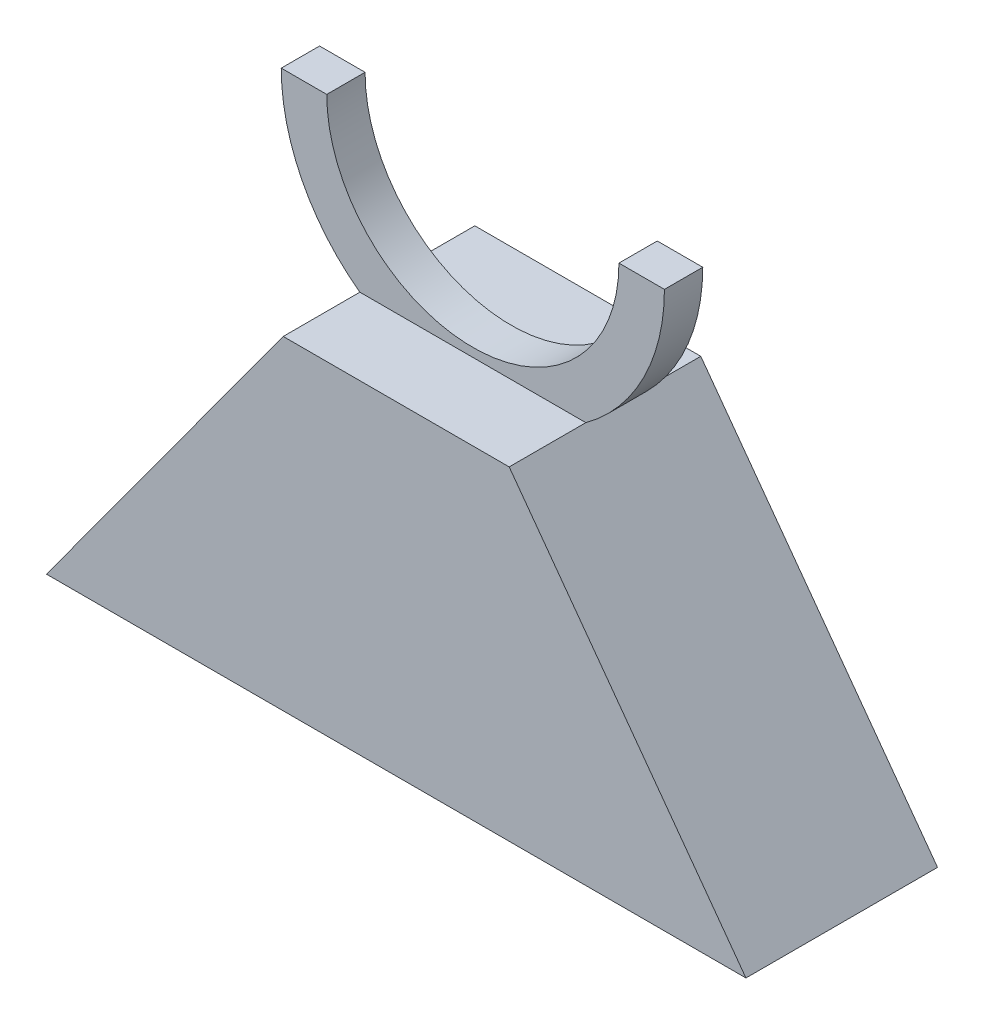
ISO-10303-21;
HEADER;
FILE_DESCRIPTION(('STEP AP214'),'2;1');
FILE_NAME('part.step','',(''),(''),'','','');
FILE_SCHEMA(('AUTOMOTIVE_DESIGN { 1 0 10303 214 1 1 1 1 }'));
ENDSEC;
DATA;
#1=APPLICATION_CONTEXT('core data for automotive mechanical design processes');
#2=APPLICATION_PROTOCOL_DEFINITION('international standard','automotive_design',2000,#1);
#3=PRODUCT_CONTEXT('',#1,'mechanical');
#4=PRODUCT('Part','Part','',(#3));
#5=PRODUCT_RELATED_PRODUCT_CATEGORY('part','',(#4));
#6=PRODUCT_DEFINITION_FORMATION('','',#4);
#7=PRODUCT_DEFINITION_CONTEXT('part definition',#1,'design');
#8=PRODUCT_DEFINITION('design','',#6,#7);
#9=PRODUCT_DEFINITION_SHAPE('','',#8);
#10=(LENGTH_UNIT() NAMED_UNIT(*) SI_UNIT(.MILLI.,.METRE.));
#11=(NAMED_UNIT(*) PLANE_ANGLE_UNIT() SI_UNIT($,.RADIAN.));
#12=(NAMED_UNIT(*) SI_UNIT($,.STERADIAN.) SOLID_ANGLE_UNIT());
#13=UNCERTAINTY_MEASURE_WITH_UNIT(LENGTH_MEASURE(1.E-05),#10,'distance_accuracy_value','');
#14=(GEOMETRIC_REPRESENTATION_CONTEXT(3) GLOBAL_UNCERTAINTY_ASSIGNED_CONTEXT((#13)) GLOBAL_UNIT_ASSIGNED_CONTEXT((#10,
#11,#12)) REPRESENTATION_CONTEXT('',''));
#15=CARTESIAN_POINT('',(0.,0.,0.));
#16=DIRECTION('',(0.,0.,1.));
#17=DIRECTION('',(1.,0.,0.));
#18=AXIS2_PLACEMENT_3D('',#15,#16,#17);
#19=CARTESIAN_POINT('',(0.,0.,-2.));
#20=DIRECTION('',(0.,0.,1.));
#21=DIRECTION('',(1.,0.,0.));
#22=AXIS2_PLACEMENT_3D('',#19,#20,#21);
#23=CYLINDRICAL_SURFACE('',#22,20.);
#24=DIRECTION('',(0.,0.,1.));
#25=VECTOR('',#24,1.);
#26=CARTESIAN_POINT('',(-11.7940862601646,-16.1523846316201,-10.));
#27=LINE('',#26,#25);
#28=CARTESIAN_POINT('',(-11.7940862601646,-16.1523846316201,-2.));
#29=VERTEX_POINT('',#28);
#30=CARTESIAN_POINT('',(-11.7940862601646,-16.1523846316201,2.));
#31=VERTEX_POINT('',#30);
#32=EDGE_CURVE('E155',#29,#31,#27,.T.);
#33=ORIENTED_EDGE('',*,*,#32,.T.);
#34=CARTESIAN_POINT('',(0.,0.,2.));
#35=DIRECTION('',(0.,0.,1.));
#36=DIRECTION('',(-1.,0.,0.));
#37=AXIS2_PLACEMENT_3D('',#34,#35,#36);
#38=CIRCLE('',#37,20.);
#39=CARTESIAN_POINT('',(-20.,0.,2.));
#40=VERTEX_POINT('',#39);
#41=EDGE_CURVE('E165',#40,#31,#38,.T.);
#42=ORIENTED_EDGE('',*,*,#41,.F.);
#43=DIRECTION('',(0.,0.,1.));
#44=VECTOR('',#43,1.);
#45=CARTESIAN_POINT('',(-20.,0.,-2.));
#46=LINE('',#45,#44);
#47=CARTESIAN_POINT('',(-20.,0.,-2.));
#48=VERTEX_POINT('',#47);
#49=EDGE_CURVE('E188',#48,#40,#46,.T.);
#50=ORIENTED_EDGE('',*,*,#49,.F.);
#51=CARTESIAN_POINT('',(0.,0.,-2.));
#52=DIRECTION('',(0.,0.,1.));
#53=DIRECTION('',(-1.,0.,0.));
#54=AXIS2_PLACEMENT_3D('',#51,#52,#53);
#55=CIRCLE('',#54,20.);
#56=EDGE_CURVE('E177',#48,#29,#55,.T.);
#57=ORIENTED_EDGE('',*,*,#56,.T.);
#58=EDGE_LOOP('',(#33,#42,#50,#57));
#59=FACE_BOUND('',#58,.T.);
#60=ADVANCED_FACE('F35',(#59),#23,.T.);
#61=CARTESIAN_POINT('',(0.,0.,-2.));
#62=DIRECTION('',(0.,0.,1.));
#63=DIRECTION('',(1.,0.,0.));
#64=AXIS2_PLACEMENT_3D('',#61,#62,#63);
#65=CYLINDRICAL_SURFACE('',#64,15.25);
#66=DIRECTION('',(0.,0.,1.));
#67=VECTOR('',#66,1.);
#68=CARTESIAN_POINT('',(-15.25,0.,-2.));
#69=LINE('',#68,#67);
#70=CARTESIAN_POINT('',(-15.25,0.,-2.));
#71=VERTEX_POINT('',#70);
#72=CARTESIAN_POINT('',(-15.25,0.,2.));
#73=VERTEX_POINT('',#72);
#74=EDGE_CURVE('E183',#71,#73,#69,.T.);
#75=ORIENTED_EDGE('',*,*,#74,.T.);
#76=CARTESIAN_POINT('',(0.,0.,2.));
#77=DIRECTION('',(0.,0.,-1.));
#78=DIRECTION('',(-1.,0.,0.));
#79=AXIS2_PLACEMENT_3D('',#76,#77,#78);
#80=CIRCLE('',#79,15.25);
#81=CARTESIAN_POINT('',(15.25,0.,2.));
#82=VERTEX_POINT('',#81);
#83=EDGE_CURVE('E158',#82,#73,#80,.T.);
#84=ORIENTED_EDGE('',*,*,#83,.F.);
#85=DIRECTION('',(0.,0.,1.));
#86=VECTOR('',#85,1.);
#87=CARTESIAN_POINT('',(15.25,0.,-2.));
#88=LINE('',#87,#86);
#89=CARTESIAN_POINT('',(15.25,0.,-2.));
#90=VERTEX_POINT('',#89);
#91=EDGE_CURVE('E43',#90,#82,#88,.T.);
#92=ORIENTED_EDGE('',*,*,#91,.F.);
#93=CARTESIAN_POINT('',(0.,0.,-2.));
#94=DIRECTION('',(0.,0.,-1.));
#95=DIRECTION('',(-1.,0.,0.));
#96=AXIS2_PLACEMENT_3D('',#93,#94,#95);
#97=CIRCLE('',#96,15.25);
#98=EDGE_CURVE('E171',#90,#71,#97,.T.);
#99=ORIENTED_EDGE('',*,*,#98,.T.);
#100=EDGE_LOOP('',(#75,#84,#92,#99));
#101=FACE_BOUND('',#100,.T.);
#102=ADVANCED_FACE('F37',(#101),#65,.F.);
#103=CARTESIAN_POINT('',(15.25,0.,-2.));
#104=DIRECTION('',(0.,1.,0.));
#105=DIRECTION('',(0.,0.,1.));
#106=AXIS2_PLACEMENT_3D('',#103,#104,#105);
#107=PLANE('',#106);
#108=ORIENTED_EDGE('',*,*,#91,.T.);
#109=DIRECTION('',(-1.,0.,0.));
#110=VECTOR('',#109,1.);
#111=CARTESIAN_POINT('',(15.25,0.,2.));
#112=LINE('',#111,#110);
#113=CARTESIAN_POINT('',(20.,0.,2.));
#114=VERTEX_POINT('',#113);
#115=EDGE_CURVE('E168',#114,#82,#112,.T.);
#116=ORIENTED_EDGE('',*,*,#115,.F.);
#117=DIRECTION('',(0.,0.,1.));
#118=VECTOR('',#117,1.);
#119=CARTESIAN_POINT('',(20.,0.,-2.));
#120=LINE('',#119,#118);
#121=CARTESIAN_POINT('',(20.,0.,-2.));
#122=VERTEX_POINT('',#121);
#123=EDGE_CURVE('E185',#122,#114,#120,.T.);
#124=ORIENTED_EDGE('',*,*,#123,.F.);
#125=DIRECTION('',(-1.,0.,0.));
#126=VECTOR('',#125,1.);
#127=CARTESIAN_POINT('',(15.25,0.,-2.));
#128=LINE('',#127,#126);
#129=EDGE_CURVE('E180',#122,#90,#128,.T.);
#130=ORIENTED_EDGE('',*,*,#129,.T.);
#131=EDGE_LOOP('',(#108,#116,#124,#130));
#132=FACE_BOUND('',#131,.T.);
#133=ADVANCED_FACE('F200',(#132),#107,.T.);
#134=DIRECTION('',(0.,0.,1.));
#135=VECTOR('',#134,1.);
#136=CARTESIAN_POINT('',(11.7940862601646,-16.1523846316201,-10.));
#137=LINE('',#136,#135);
#138=CARTESIAN_POINT('',(11.7940862601646,-16.1523846316201,-2.));
#139=VERTEX_POINT('',#138);
#140=CARTESIAN_POINT('',(11.7940862601646,-16.1523846316201,2.));
#141=VERTEX_POINT('',#140);
#142=EDGE_CURVE('E50',#139,#141,#137,.T.);
#143=ORIENTED_EDGE('',*,*,#142,.F.);
#144=EDGE_CURVE('E176',#139,#122,#55,.T.);
#145=ORIENTED_EDGE('',*,*,#144,.T.);
#146=ORIENTED_EDGE('',*,*,#123,.T.);
#147=EDGE_CURVE('E164',#141,#114,#38,.T.);
#148=ORIENTED_EDGE('',*,*,#147,.F.);
#149=EDGE_LOOP('',(#143,#145,#146,#148));
#150=FACE_BOUND('',#149,.T.);
#151=ADVANCED_FACE('F210',(#150),#23,.T.);
#152=CARTESIAN_POINT('',(-20.,0.,-2.));
#153=DIRECTION('',(0.,1.,0.));
#154=DIRECTION('',(0.,0.,1.));
#155=AXIS2_PLACEMENT_3D('',#152,#153,#154);
#156=PLANE('',#155);
#157=ORIENTED_EDGE('',*,*,#49,.T.);
#158=DIRECTION('',(-1.,0.,0.));
#159=VECTOR('',#158,1.);
#160=CARTESIAN_POINT('',(-20.,0.,2.));
#161=LINE('',#160,#159);
#162=EDGE_CURVE('E161',#73,#40,#161,.T.);
#163=ORIENTED_EDGE('',*,*,#162,.F.);
#164=ORIENTED_EDGE('',*,*,#74,.F.);
#165=DIRECTION('',(-1.,0.,0.));
#166=VECTOR('',#165,1.);
#167=CARTESIAN_POINT('',(-20.,0.,-2.));
#168=LINE('',#167,#166);
#169=EDGE_CURVE('E173',#71,#48,#168,.T.);
#170=ORIENTED_EDGE('',*,*,#169,.T.);
#171=EDGE_LOOP('',(#157,#163,#164,#170));
#172=FACE_BOUND('',#171,.T.);
#173=ADVANCED_FACE('F192',(#172),#156,.T.);
#174=CARTESIAN_POINT('',(0.,0.,-2.));
#175=DIRECTION('',(0.,0.,-1.));
#176=DIRECTION('',(-1.,0.,0.));
#177=AXIS2_PLACEMENT_3D('',#174,#175,#176);
#178=PLANE('',#177);
#179=DIRECTION('',(1.,0.,0.));
#180=VECTOR('',#179,1.);
#181=CARTESIAN_POINT('',(0.,-16.1523846316201,-2.));
#182=LINE('',#181,#180);
#183=EDGE_CURVE('E150',#29,#139,#182,.T.);
#184=ORIENTED_EDGE('',*,*,#183,.F.);
#185=ORIENTED_EDGE('',*,*,#56,.F.);
#186=ORIENTED_EDGE('',*,*,#169,.F.);
#187=ORIENTED_EDGE('',*,*,#98,.F.);
#188=ORIENTED_EDGE('',*,*,#129,.F.);
#189=ORIENTED_EDGE('',*,*,#144,.F.);
#190=EDGE_LOOP('',(#184,#185,#186,#187,#188,#189));
#191=FACE_BOUND('',#190,.T.);
#192=ADVANCED_FACE('F205',(#191),#178,.T.);
#193=CARTESIAN_POINT('',(0.,0.,2.));
#194=DIRECTION('',(0.,0.,-1.));
#195=DIRECTION('',(-1.,0.,0.));
#196=AXIS2_PLACEMENT_3D('',#193,#194,#195);
#197=PLANE('',#196);
#198=ORIENTED_EDGE('',*,*,#41,.T.);
#199=DIRECTION('',(1.,0.,0.));
#200=VECTOR('',#199,1.);
#201=CARTESIAN_POINT('',(0.,-16.1523846316201,2.));
#202=LINE('',#201,#200);
#203=EDGE_CURVE('E11',#31,#141,#202,.T.);
#204=ORIENTED_EDGE('',*,*,#203,.T.);
#205=ORIENTED_EDGE('',*,*,#147,.T.);
#206=ORIENTED_EDGE('',*,*,#115,.T.);
#207=ORIENTED_EDGE('',*,*,#83,.T.);
#208=ORIENTED_EDGE('',*,*,#162,.T.);
#209=EDGE_LOOP('',(#198,#204,#205,#206,#207,#208));
#210=FACE_BOUND('',#209,.T.);
#211=ADVANCED_FACE('F195',(#210),#197,.F.);
#212=CARTESIAN_POINT('',(0.,-16.1523846316201,-10.));
#213=DIRECTION('',(0.,1.,0.));
#214=DIRECTION('',(-1.,0.,0.));
#215=AXIS2_PLACEMENT_3D('',#212,#213,#214);
#216=PLANE('',#215);
#217=ORIENTED_EDGE('',*,*,#203,.F.);
#218=CARTESIAN_POINT('',(-11.7940862601646,-16.1523846316201,10.));
#219=VERTEX_POINT('',#218);
#220=EDGE_CURVE('E124',#31,#219,#27,.T.);
#221=ORIENTED_EDGE('',*,*,#220,.T.);
#222=DIRECTION('',(-1.,0.,0.));
#223=VECTOR('',#222,1.);
#224=CARTESIAN_POINT('',(0.,-16.1523846316201,10.));
#225=LINE('',#224,#223);
#226=CARTESIAN_POINT('',(11.7940862601646,-16.1523846316201,10.));
#227=VERTEX_POINT('',#226);
#228=EDGE_CURVE('E121',#227,#219,#225,.T.);
#229=ORIENTED_EDGE('',*,*,#228,.F.);
#230=EDGE_CURVE('E111',#141,#227,#137,.T.);
#231=ORIENTED_EDGE('',*,*,#230,.F.);
#232=EDGE_LOOP('',(#217,#221,#229,#231));
#233=FACE_BOUND('',#232,.T.);
#234=ADVANCED_FACE('F122',(#233),#216,.T.);
#235=CARTESIAN_POINT('',(0.,0.,-10.));
#236=DIRECTION('',(0.807619231581003,0.589704313008231,0.));
#237=DIRECTION('',(-0.589704313008231,0.807619231581003,0.));
#238=AXIS2_PLACEMENT_3D('',#235,#236,#237);
#239=PLANE('',#238);
#240=CARTESIAN_POINT('',(11.7940862601646,-16.1523846316201,-10.));
#241=VERTEX_POINT('',#240);
#242=EDGE_CURVE('E119',#241,#139,#137,.T.);
#243=ORIENTED_EDGE('',*,*,#242,.T.);
#244=ORIENTED_EDGE('',*,*,#142,.T.);
#245=ORIENTED_EDGE('',*,*,#230,.T.);
#246=DIRECTION('',(-0.589704313008231,0.807619231581003,0.));
#247=VECTOR('',#246,1.);
#248=CARTESIAN_POINT('',(0.,0.,10.));
#249=LINE('',#248,#247);
#250=CARTESIAN_POINT('',(36.5088082321802,-50.,10.));
#251=VERTEX_POINT('',#250);
#252=EDGE_CURVE('E115',#251,#227,#249,.T.);
#253=ORIENTED_EDGE('',*,*,#252,.F.);
#254=DIRECTION('',(0.,0.,1.));
#255=VECTOR('',#254,1.);
#256=CARTESIAN_POINT('',(36.5088082321802,-50.,-10.));
#257=LINE('',#256,#255);
#258=CARTESIAN_POINT('',(36.5088082321802,-50.,-10.));
#259=VERTEX_POINT('',#258);
#260=EDGE_CURVE('E148',#259,#251,#257,.T.);
#261=ORIENTED_EDGE('',*,*,#260,.F.);
#262=DIRECTION('',(-0.589704313008231,0.807619231581003,0.));
#263=VECTOR('',#262,1.);
#264=CARTESIAN_POINT('',(0.,0.,-10.));
#265=LINE('',#264,#263);
#266=EDGE_CURVE('E138',#259,#241,#265,.T.);
#267=ORIENTED_EDGE('',*,*,#266,.T.);
#268=EDGE_LOOP('',(#243,#244,#245,#253,#261,#267));
#269=FACE_BOUND('',#268,.T.);
#270=ADVANCED_FACE('F113',(#269),#239,.T.);
#271=CARTESIAN_POINT('',(0.,-50.,-10.));
#272=DIRECTION('',(0.,-1.,0.));
#273=DIRECTION('',(1.,0.,0.));
#274=AXIS2_PLACEMENT_3D('',#271,#272,#273);
#275=PLANE('',#274);
#276=ORIENTED_EDGE('',*,*,#260,.T.);
#277=DIRECTION('',(1.,0.,0.));
#278=VECTOR('',#277,1.);
#279=CARTESIAN_POINT('',(0.,-50.,10.));
#280=LINE('',#279,#278);
#281=CARTESIAN_POINT('',(-36.5088082321802,-50.,10.));
#282=VERTEX_POINT('',#281);
#283=EDGE_CURVE('E133',#282,#251,#280,.T.);
#284=ORIENTED_EDGE('',*,*,#283,.F.);
#285=DIRECTION('',(0.,0.,1.));
#286=VECTOR('',#285,1.);
#287=CARTESIAN_POINT('',(-36.5088082321802,-50.,-10.));
#288=LINE('',#287,#286);
#289=CARTESIAN_POINT('',(-36.5088082321802,-50.,-10.));
#290=VERTEX_POINT('',#289);
#291=EDGE_CURVE('E151',#290,#282,#288,.T.);
#292=ORIENTED_EDGE('',*,*,#291,.F.);
#293=DIRECTION('',(1.,0.,0.));
#294=VECTOR('',#293,1.);
#295=CARTESIAN_POINT('',(0.,-50.,-10.));
#296=LINE('',#295,#294);
#297=EDGE_CURVE('E117',#290,#259,#296,.T.);
#298=ORIENTED_EDGE('',*,*,#297,.T.);
#299=EDGE_LOOP('',(#276,#284,#292,#298));
#300=FACE_BOUND('',#299,.T.);
#301=ADVANCED_FACE('F276',(#300),#275,.T.);
#302=CARTESIAN_POINT('',(0.,0.,-10.));
#303=DIRECTION('',(0.807619231581003,-0.589704313008231,0.));
#304=DIRECTION('',(0.589704313008231,0.807619231581003,0.));
#305=AXIS2_PLACEMENT_3D('',#302,#303,#304);
#306=PLANE('',#305);
#307=ORIENTED_EDGE('',*,*,#291,.T.);
#308=DIRECTION('',(0.589704313008231,0.807619231581003,0.));
#309=VECTOR('',#308,1.);
#310=CARTESIAN_POINT('',(0.,0.,10.));
#311=LINE('',#310,#309);
#312=EDGE_CURVE('E128',#282,#219,#311,.T.);
#313=ORIENTED_EDGE('',*,*,#312,.T.);
#314=ORIENTED_EDGE('',*,*,#220,.F.);
#315=ORIENTED_EDGE('',*,*,#32,.F.);
#316=CARTESIAN_POINT('',(-11.7940862601646,-16.1523846316201,-10.));
#317=VERTEX_POINT('',#316);
#318=EDGE_CURVE('E153',#317,#29,#27,.T.);
#319=ORIENTED_EDGE('',*,*,#318,.F.);
#320=DIRECTION('',(0.589704313008231,0.807619231581003,0.));
#321=VECTOR('',#320,1.);
#322=CARTESIAN_POINT('',(0.,0.,-10.));
#323=LINE('',#322,#321);
#324=EDGE_CURVE('E144',#290,#317,#323,.T.);
#325=ORIENTED_EDGE('',*,*,#324,.F.);
#326=EDGE_LOOP('',(#307,#313,#314,#315,#319,#325));
#327=FACE_BOUND('',#326,.T.);
#328=ADVANCED_FACE('F285',(#327),#306,.F.);
#329=ORIENTED_EDGE('',*,*,#318,.T.);
#330=ORIENTED_EDGE('',*,*,#183,.T.);
#331=ORIENTED_EDGE('',*,*,#242,.F.);
#332=DIRECTION('',(-1.,0.,0.));
#333=VECTOR('',#332,1.);
#334=CARTESIAN_POINT('',(0.,-16.1523846316201,-10.));
#335=LINE('',#334,#333);
#336=EDGE_CURVE('E141',#241,#317,#335,.T.);
#337=ORIENTED_EDGE('',*,*,#336,.T.);
#338=EDGE_LOOP('',(#329,#330,#331,#337));
#339=FACE_BOUND('',#338,.T.);
#340=ADVANCED_FACE('F268',(#339),#216,.T.);
#341=CARTESIAN_POINT('',(0.,0.,-10.));
#342=DIRECTION('',(0.,0.,1.));
#343=DIRECTION('',(1.,0.,0.));
#344=AXIS2_PLACEMENT_3D('',#341,#342,#343);
#345=PLANE('',#344);
#346=ORIENTED_EDGE('',*,*,#266,.F.);
#347=ORIENTED_EDGE('',*,*,#297,.F.);
#348=ORIENTED_EDGE('',*,*,#324,.T.);
#349=ORIENTED_EDGE('',*,*,#336,.F.);
#350=EDGE_LOOP('',(#346,#347,#348,#349));
#351=FACE_BOUND('',#350,.T.);
#352=ADVANCED_FACE('F304',(#351),#345,.F.);
#353=CARTESIAN_POINT('',(0.,0.,10.));
#354=DIRECTION('',(0.,0.,1.));
#355=DIRECTION('',(1.,0.,0.));
#356=AXIS2_PLACEMENT_3D('',#353,#354,#355);
#357=PLANE('',#356);
#358=ORIENTED_EDGE('',*,*,#252,.T.);
#359=ORIENTED_EDGE('',*,*,#228,.T.);
#360=ORIENTED_EDGE('',*,*,#312,.F.);
#361=ORIENTED_EDGE('',*,*,#283,.T.);
#362=EDGE_LOOP('',(#358,#359,#360,#361));
#363=FACE_BOUND('',#362,.T.);
#364=ADVANCED_FACE('F131',(#363),#357,.T.);
#365=CLOSED_SHELL('',(#60,#102,#133,#151,#173,#192,#211,#234,#270,#301,#328,#340,#352,#364));
#366=MANIFOLD_SOLID_BREP('B2',#365);
#367=ADVANCED_BREP_SHAPE_REPRESENTATION('',(#18,#366),#14);
#368=SHAPE_DEFINITION_REPRESENTATION(#9,#367);
ENDSEC;
END-ISO-10303-21;
